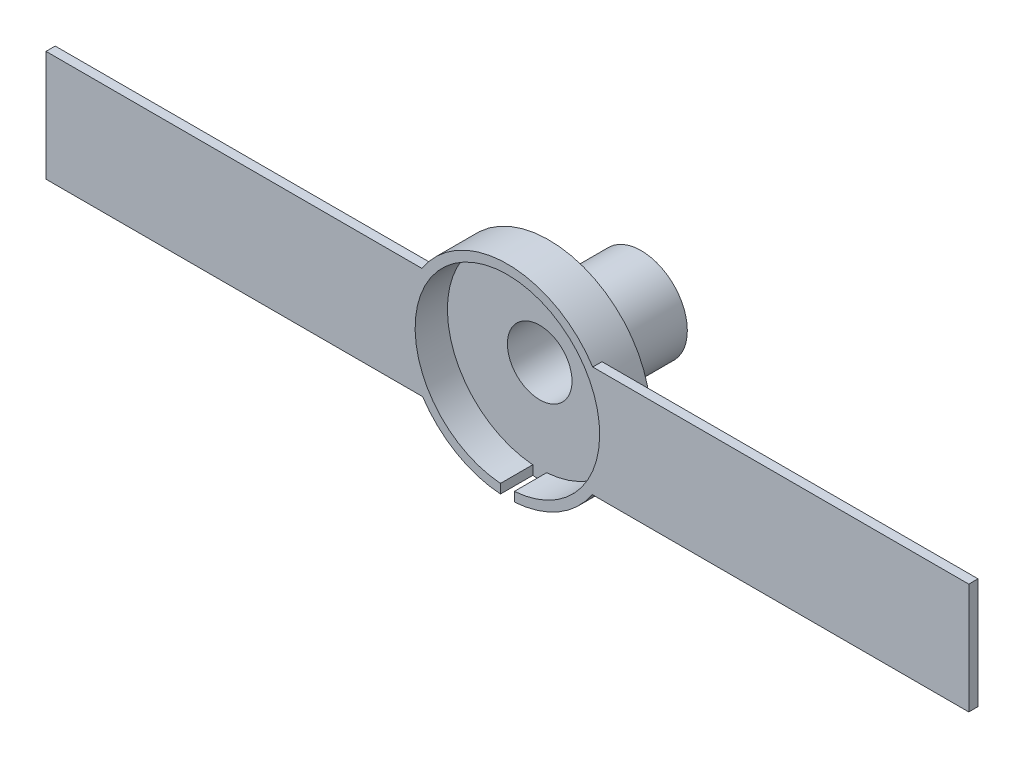
ISO-10303-21;
HEADER;
FILE_DESCRIPTION(('STEP AP214'),'2;1');
FILE_NAME('part.step','',(''),(''),'','','');
FILE_SCHEMA(('AUTOMOTIVE_DESIGN { 1 0 10303 214 1 1 1 1 }'));
ENDSEC;
DATA;
#1=APPLICATION_CONTEXT('core data for automotive mechanical design processes');
#2=APPLICATION_PROTOCOL_DEFINITION('international standard','automotive_design',2000,#1);
#3=PRODUCT_CONTEXT('',#1,'mechanical');
#4=PRODUCT('Part','Part','',(#3));
#5=PRODUCT_RELATED_PRODUCT_CATEGORY('part','',(#4));
#6=PRODUCT_DEFINITION_FORMATION('','',#4);
#7=PRODUCT_DEFINITION_CONTEXT('part definition',#1,'design');
#8=PRODUCT_DEFINITION('design','',#6,#7);
#9=PRODUCT_DEFINITION_SHAPE('','',#8);
#10=(LENGTH_UNIT() NAMED_UNIT(*) SI_UNIT(.MILLI.,.METRE.));
#11=(NAMED_UNIT(*) PLANE_ANGLE_UNIT() SI_UNIT($,.RADIAN.));
#12=(NAMED_UNIT(*) SI_UNIT($,.STERADIAN.) SOLID_ANGLE_UNIT());
#13=UNCERTAINTY_MEASURE_WITH_UNIT(LENGTH_MEASURE(1.E-05),#10,'distance_accuracy_value','');
#14=(GEOMETRIC_REPRESENTATION_CONTEXT(3) GLOBAL_UNCERTAINTY_ASSIGNED_CONTEXT((#13)) GLOBAL_UNIT_ASSIGNED_CONTEXT((#10,
#11,#12)) REPRESENTATION_CONTEXT('',''));
#15=CARTESIAN_POINT('',(0.,0.,0.));
#16=DIRECTION('',(0.,0.,1.));
#17=DIRECTION('',(1.,0.,0.));
#18=AXIS2_PLACEMENT_3D('',#15,#16,#17);
#19=CARTESIAN_POINT('',(0.,0.,11.));
#20=DIRECTION('',(0.,0.,-1.));
#21=DIRECTION('',(-1.,0.,0.));
#22=AXIS2_PLACEMENT_3D('',#19,#20,#21);
#23=CYLINDRICAL_SURFACE('',#22,11.);
#24=CARTESIAN_POINT('',(0.,0.,10.));
#25=DIRECTION('',(0.,0.,1.));
#26=DIRECTION('',(1.,0.,0.));
#27=AXIS2_PLACEMENT_3D('',#24,#25,#26);
#28=CIRCLE('',#27,11.);
#29=CARTESIAN_POINT('',(11.,0.,10.));
#30=VERTEX_POINT('',#29);
#31=EDGE_CURVE('E249',#30,#30,#28,.T.);
#32=ORIENTED_EDGE('',*,*,#31,.T.);
#33=EDGE_LOOP('',(#32));
#34=FACE_BOUND('',#33,.T.);
#35=DIRECTION('',(0.,0.,-1.));
#36=VECTOR('',#35,1.);
#37=CARTESIAN_POINT('',(-9.18653825051517,-6.05041444628561,11.));
#38=LINE('',#37,#36);
#39=CARTESIAN_POINT('',(-9.18653825051517,-6.05041444628561,14.5));
#40=VERTEX_POINT('',#39);
#41=CARTESIAN_POINT('',(-9.18653825051517,-6.05041444628561,13.5));
#42=VERTEX_POINT('',#41);
#43=EDGE_CURVE('E55',#40,#42,#38,.T.);
#44=ORIENTED_EDGE('',*,*,#43,.T.);
#45=CARTESIAN_POINT('',(0.,0.,13.5));
#46=DIRECTION('',(0.,0.,1.));
#47=DIRECTION('',(1.,0.,0.));
#48=AXIS2_PLACEMENT_3D('',#45,#46,#47);
#49=CIRCLE('',#48,11.);
#50=CARTESIAN_POINT('',(-9.25215822060091,5.94958555371439,13.5));
#51=VERTEX_POINT('',#50);
#52=EDGE_CURVE('E137',#42,#51,#49,.F.);
#53=ORIENTED_EDGE('',*,*,#52,.T.);
#54=DIRECTION('',(0.,0.,-1.));
#55=VECTOR('',#54,1.);
#56=CARTESIAN_POINT('',(-9.25215822060091,5.94958555371439,11.));
#57=LINE('',#56,#55);
#58=CARTESIAN_POINT('',(-9.25215822060091,5.94958555371439,14.5));
#59=VERTEX_POINT('',#58);
#60=EDGE_CURVE('E157',#51,#59,#57,.F.);
#61=ORIENTED_EDGE('',*,*,#60,.T.);
#62=CARTESIAN_POINT('',(0.,0.,14.5));
#63=DIRECTION('',(0.,0.,1.));
#64=DIRECTION('',(1.,0.,0.));
#65=AXIS2_PLACEMENT_3D('',#62,#63,#64);
#66=CIRCLE('',#65,11.);
#67=CARTESIAN_POINT('',(9.25215822060091,5.94958555371439,14.5));
#68=VERTEX_POINT('',#67);
#69=EDGE_CURVE('E245',#68,#59,#66,.T.);
#70=ORIENTED_EDGE('',*,*,#69,.F.);
#71=DIRECTION('',(0.,0.,-1.));
#72=VECTOR('',#71,1.);
#73=CARTESIAN_POINT('',(9.25215822060091,5.94958555371439,11.));
#74=LINE('',#73,#72);
#75=CARTESIAN_POINT('',(9.25215822060091,5.94958555371439,13.5));
#76=VERTEX_POINT('',#75);
#77=EDGE_CURVE('E63',#76,#68,#74,.F.);
#78=ORIENTED_EDGE('',*,*,#77,.F.);
#79=CARTESIAN_POINT('',(0.,0.,13.5));
#80=DIRECTION('',(0.,0.,-1.));
#81=DIRECTION('',(-1.,0.,0.));
#82=AXIS2_PLACEMENT_3D('',#79,#80,#81);
#83=CIRCLE('',#82,11.);
#84=CARTESIAN_POINT('',(9.18653825051517,-6.05041444628561,13.5));
#85=VERTEX_POINT('',#84);
#86=EDGE_CURVE('E174',#85,#76,#83,.F.);
#87=ORIENTED_EDGE('',*,*,#86,.F.);
#88=DIRECTION('',(0.,0.,-1.));
#89=VECTOR('',#88,1.);
#90=CARTESIAN_POINT('',(9.18653825051517,-6.05041444628561,11.));
#91=LINE('',#90,#89);
#92=CARTESIAN_POINT('',(9.18653825051517,-6.05041444628561,14.5));
#93=VERTEX_POINT('',#92);
#94=EDGE_CURVE('E199',#93,#85,#91,.T.);
#95=ORIENTED_EDGE('',*,*,#94,.F.);
#96=CARTESIAN_POINT('',(0.750000000000002,-10.974402033824,14.5));
#97=VERTEX_POINT('',#96);
#98=EDGE_CURVE('E240',#97,#93,#66,.T.);
#99=ORIENTED_EDGE('',*,*,#98,.F.);
#100=DIRECTION('',(0.,0.,-1.));
#101=VECTOR('',#100,1.);
#102=CARTESIAN_POINT('',(0.750000000000001,-10.974402033824,11.));
#103=LINE('',#102,#101);
#104=CARTESIAN_POINT('',(0.750000000000001,-10.974402033824,11.));
#105=VERTEX_POINT('',#104);
#106=EDGE_CURVE('E217',#105,#97,#103,.F.);
#107=ORIENTED_EDGE('',*,*,#106,.F.);
#108=CARTESIAN_POINT('',(0.,0.,11.));
#109=DIRECTION('',(0.,0.,-1.));
#110=DIRECTION('',(-1.,0.,0.));
#111=AXIS2_PLACEMENT_3D('',#108,#109,#110);
#112=CIRCLE('',#111,11.);
#113=CARTESIAN_POINT('',(-0.749999999999999,-10.974402033824,11.));
#114=VERTEX_POINT('',#113);
#115=EDGE_CURVE('E220',#114,#105,#112,.F.);
#116=ORIENTED_EDGE('',*,*,#115,.F.);
#117=DIRECTION('',(0.,0.,-1.));
#118=VECTOR('',#117,1.);
#119=CARTESIAN_POINT('',(-0.749999999999999,-10.974402033824,11.));
#120=LINE('',#119,#118);
#121=CARTESIAN_POINT('',(-0.749999999999999,-10.974402033824,14.5));
#122=VERTEX_POINT('',#121);
#123=EDGE_CURVE('E212',#122,#114,#120,.T.);
#124=ORIENTED_EDGE('',*,*,#123,.F.);
#125=EDGE_CURVE('E239',#40,#122,#66,.T.);
#126=ORIENTED_EDGE('',*,*,#125,.F.);
#127=EDGE_LOOP('',(#44,#53,#61,#70,#78,#87,#95,#99,#107,#116,#124,#126));
#128=FACE_BOUND('',#127,.T.);
#129=ADVANCED_FACE('F39',(#34,#128),#23,.T.);
#130=CARTESIAN_POINT('',(0.,0.,11.));
#131=DIRECTION('',(0.,0.,1.));
#132=DIRECTION('',(1.,0.,0.));
#133=AXIS2_PLACEMENT_3D('',#130,#131,#132);
#134=PLANE('',#133);
#135=CARTESIAN_POINT('',(0.,0.,11.));
#136=DIRECTION('',(0.,0.,1.));
#137=DIRECTION('',(1.,0.,0.));
#138=AXIS2_PLACEMENT_3D('',#135,#136,#137);
#139=CIRCLE('',#138,3.5);
#140=CARTESIAN_POINT('',(3.5,0.,11.));
#141=VERTEX_POINT('',#140);
#142=EDGE_CURVE('E244',#141,#141,#139,.T.);
#143=ORIENTED_EDGE('',*,*,#142,.F.);
#144=EDGE_LOOP('',(#143));
#145=FACE_BOUND('',#144,.T.);
#146=DIRECTION('',(0.,1.,0.));
#147=VECTOR('',#146,1.);
#148=CARTESIAN_POINT('',(0.750000000000001,-11.001,11.));
#149=LINE('',#148,#147);
#150=CARTESIAN_POINT('',(0.750000000000001,-9.97183533758957,11.));
#151=VERTEX_POINT('',#150);
#152=EDGE_CURVE('E183',#105,#151,#149,.T.);
#153=ORIENTED_EDGE('',*,*,#152,.T.);
#154=CARTESIAN_POINT('',(0.,0.,11.));
#155=DIRECTION('',(0.,0.,1.));
#156=DIRECTION('',(1.,0.,0.));
#157=AXIS2_PLACEMENT_3D('',#154,#155,#156);
#158=CIRCLE('',#157,10.);
#159=CARTESIAN_POINT('',(-0.749999999999999,-9.97183533758957,11.));
#160=VERTEX_POINT('',#159);
#161=EDGE_CURVE('E262',#160,#151,#158,.F.);
#162=ORIENTED_EDGE('',*,*,#161,.F.);
#163=DIRECTION('',(0.,1.,0.));
#164=VECTOR('',#163,1.);
#165=CARTESIAN_POINT('',(-0.749999999999999,-11.001,11.));
#166=LINE('',#165,#164);
#167=EDGE_CURVE('E224',#114,#160,#166,.T.);
#168=ORIENTED_EDGE('',*,*,#167,.F.);
#169=ORIENTED_EDGE('',*,*,#115,.T.);
#170=EDGE_LOOP('',(#153,#162,#168,#169));
#171=FACE_BOUND('',#170,.T.);
#172=ADVANCED_FACE('F308',(#145,#171),#134,.T.);
#173=CARTESIAN_POINT('',(0.,0.,0.));
#174=DIRECTION('',(0.,0.,1.));
#175=DIRECTION('',(1.,0.,0.));
#176=AXIS2_PLACEMENT_3D('',#173,#174,#175);
#177=PLANE('',#176);
#178=CARTESIAN_POINT('',(0.,0.,0.));
#179=DIRECTION('',(0.,0.,1.));
#180=DIRECTION('',(1.,0.,0.));
#181=AXIS2_PLACEMENT_3D('',#178,#179,#180);
#182=CIRCLE('',#181,5.);
#183=CARTESIAN_POINT('',(5.,0.,0.));
#184=VERTEX_POINT('',#183);
#185=EDGE_CURVE('E257',#184,#184,#182,.T.);
#186=ORIENTED_EDGE('',*,*,#185,.F.);
#187=EDGE_LOOP('',(#186));
#188=FACE_BOUND('',#187,.T.);
#189=CARTESIAN_POINT('',(0.,0.,0.));
#190=DIRECTION('',(0.,0.,1.));
#191=DIRECTION('',(1.,0.,0.));
#192=AXIS2_PLACEMENT_3D('',#189,#190,#191);
#193=CIRCLE('',#192,3.5);
#194=CARTESIAN_POINT('',(3.5,0.,0.));
#195=VERTEX_POINT('',#194);
#196=EDGE_CURVE('E253',#195,#195,#193,.T.);
#197=ORIENTED_EDGE('',*,*,#196,.T.);
#198=EDGE_LOOP('',(#197));
#199=FACE_BOUND('',#198,.T.);
#200=ADVANCED_FACE('F310',(#188,#199),#177,.F.);
#201=CARTESIAN_POINT('',(0.,0.,10.));
#202=DIRECTION('',(0.,0.,-1.));
#203=DIRECTION('',(-1.,0.,0.));
#204=AXIS2_PLACEMENT_3D('',#201,#202,#203);
#205=CYLINDRICAL_SURFACE('',#204,5.);
#206=CARTESIAN_POINT('',(0.,0.,10.));
#207=DIRECTION('',(0.,0.,1.));
#208=DIRECTION('',(1.,0.,0.));
#209=AXIS2_PLACEMENT_3D('',#206,#207,#208);
#210=CIRCLE('',#209,5.);
#211=CARTESIAN_POINT('',(5.,0.,10.));
#212=VERTEX_POINT('',#211);
#213=EDGE_CURVE('E258',#212,#212,#210,.T.);
#214=ORIENTED_EDGE('',*,*,#213,.F.);
#215=EDGE_LOOP('',(#214));
#216=FACE_BOUND('',#215,.T.);
#217=ORIENTED_EDGE('',*,*,#185,.T.);
#218=EDGE_LOOP('',(#217));
#219=FACE_BOUND('',#218,.T.);
#220=ADVANCED_FACE('F41',(#216,#219),#205,.T.);
#221=CARTESIAN_POINT('',(0.,0.,10.));
#222=DIRECTION('',(0.,0.,-1.));
#223=DIRECTION('',(-1.,0.,0.));
#224=AXIS2_PLACEMENT_3D('',#221,#222,#223);
#225=CYLINDRICAL_SURFACE('',#224,3.5);
#226=ORIENTED_EDGE('',*,*,#196,.F.);
#227=EDGE_LOOP('',(#226));
#228=FACE_BOUND('',#227,.T.);
#229=ORIENTED_EDGE('',*,*,#142,.T.);
#230=EDGE_LOOP('',(#229));
#231=FACE_BOUND('',#230,.T.);
#232=ADVANCED_FACE('F326',(#228,#231),#225,.F.);
#233=CARTESIAN_POINT('',(0.,0.,10.));
#234=DIRECTION('',(0.,0.,1.));
#235=DIRECTION('',(1.,0.,0.));
#236=AXIS2_PLACEMENT_3D('',#233,#234,#235);
#237=PLANE('',#236);
#238=ORIENTED_EDGE('',*,*,#213,.T.);
#239=EDGE_LOOP('',(#238));
#240=FACE_BOUND('',#239,.T.);
#241=ORIENTED_EDGE('',*,*,#31,.F.);
#242=EDGE_LOOP('',(#241));
#243=FACE_BOUND('',#242,.T.);
#244=ADVANCED_FACE('F324',(#240,#243),#237,.F.);
#245=CARTESIAN_POINT('',(0.,0.,14.5));
#246=DIRECTION('',(0.,0.,1.));
#247=DIRECTION('',(1.,0.,0.));
#248=AXIS2_PLACEMENT_3D('',#245,#246,#247);
#249=PLANE('',#248);
#250=DIRECTION('',(0.,1.,0.));
#251=VECTOR('',#250,1.);
#252=CARTESIAN_POINT('',(0.750000000000002,-11.001,14.5));
#253=LINE('',#252,#251);
#254=CARTESIAN_POINT('',(0.750000000000002,-9.97183533758957,14.5));
#255=VERTEX_POINT('',#254);
#256=EDGE_CURVE('E225',#97,#255,#253,.T.);
#257=ORIENTED_EDGE('',*,*,#256,.F.);
#258=ORIENTED_EDGE('',*,*,#98,.T.);
#259=DIRECTION('',(1.,0.,0.));
#260=VECTOR('',#259,1.);
#261=CARTESIAN_POINT('',(-11.001,-6.05041444628561,14.5));
#262=LINE('',#261,#260);
#263=CARTESIAN_POINT('',(50.,-6.05041444628561,14.5));
#264=VERTEX_POINT('',#263);
#265=EDGE_CURVE('E178',#93,#264,#262,.T.);
#266=ORIENTED_EDGE('',*,*,#265,.T.);
#267=DIRECTION('',(0.,-1.,0.));
#268=VECTOR('',#267,1.);
#269=CARTESIAN_POINT('',(50.,-6.05041444628561,14.5));
#270=LINE('',#269,#268);
#271=CARTESIAN_POINT('',(50.,5.94958555371439,14.5));
#272=VERTEX_POINT('',#271);
#273=EDGE_CURVE('E184',#272,#264,#270,.T.);
#274=ORIENTED_EDGE('',*,*,#273,.F.);
#275=DIRECTION('',(1.,0.,0.));
#276=VECTOR('',#275,1.);
#277=CARTESIAN_POINT('',(-11.001,5.94958555371439,14.5));
#278=LINE('',#277,#276);
#279=EDGE_CURVE('E177',#68,#272,#278,.T.);
#280=ORIENTED_EDGE('',*,*,#279,.F.);
#281=ORIENTED_EDGE('',*,*,#69,.T.);
#282=DIRECTION('',(-1.,0.,0.));
#283=VECTOR('',#282,1.);
#284=CARTESIAN_POINT('',(50.001,5.94958555371439,14.5));
#285=LINE('',#284,#283);
#286=CARTESIAN_POINT('',(-50.,5.94958555371439,14.5));
#287=VERTEX_POINT('',#286);
#288=EDGE_CURVE('E167',#59,#287,#285,.T.);
#289=ORIENTED_EDGE('',*,*,#288,.T.);
#290=DIRECTION('',(0.,-1.,0.));
#291=VECTOR('',#290,1.);
#292=CARTESIAN_POINT('',(-50.,-6.05041444628561,14.5));
#293=LINE('',#292,#291);
#294=CARTESIAN_POINT('',(-50.,-6.05041444628561,14.5));
#295=VERTEX_POINT('',#294);
#296=EDGE_CURVE('E149',#287,#295,#293,.T.);
#297=ORIENTED_EDGE('',*,*,#296,.T.);
#298=DIRECTION('',(-1.,0.,0.));
#299=VECTOR('',#298,1.);
#300=CARTESIAN_POINT('',(50.001,-6.05041444628561,14.5));
#301=LINE('',#300,#299);
#302=EDGE_CURVE('E139',#40,#295,#301,.T.);
#303=ORIENTED_EDGE('',*,*,#302,.F.);
#304=ORIENTED_EDGE('',*,*,#125,.T.);
#305=DIRECTION('',(0.,1.,0.));
#306=VECTOR('',#305,1.);
#307=CARTESIAN_POINT('',(-0.749999999999999,-11.001,14.5));
#308=LINE('',#307,#306);
#309=CARTESIAN_POINT('',(-0.749999999999999,-9.97183533758957,14.5));
#310=VERTEX_POINT('',#309);
#311=EDGE_CURVE('E228',#122,#310,#308,.T.);
#312=ORIENTED_EDGE('',*,*,#311,.T.);
#313=CARTESIAN_POINT('',(0.,0.,14.5));
#314=DIRECTION('',(0.,0.,1.));
#315=DIRECTION('',(1.,0.,0.));
#316=AXIS2_PLACEMENT_3D('',#313,#314,#315);
#317=CIRCLE('',#316,10.);
#318=EDGE_CURVE('E216',#255,#310,#317,.T.);
#319=ORIENTED_EDGE('',*,*,#318,.F.);
#320=EDGE_LOOP('',(#257,#258,#266,#274,#280,#281,#289,#297,#303,#304,#312,#319));
#321=FACE_BOUND('',#320,.T.);
#322=ADVANCED_FACE('F279',(#321),#249,.T.);
#323=CARTESIAN_POINT('',(0.,0.,14.5));
#324=DIRECTION('',(0.,0.,-1.));
#325=DIRECTION('',(-1.,0.,0.));
#326=AXIS2_PLACEMENT_3D('',#323,#324,#325);
#327=CYLINDRICAL_SURFACE('',#326,10.);
#328=DIRECTION('',(0.,0.,-1.));
#329=VECTOR('',#328,1.);
#330=CARTESIAN_POINT('',(0.750000000000002,-9.97183533758957,14.5));
#331=LINE('',#330,#329);
#332=EDGE_CURVE('E11',#255,#151,#331,.T.);
#333=ORIENTED_EDGE('',*,*,#332,.F.);
#334=ORIENTED_EDGE('',*,*,#318,.T.);
#335=DIRECTION('',(0.,0.,-1.));
#336=VECTOR('',#335,1.);
#337=CARTESIAN_POINT('',(-0.749999999999999,-9.97183533758957,14.5));
#338=LINE('',#337,#336);
#339=EDGE_CURVE('E48',#160,#310,#338,.F.);
#340=ORIENTED_EDGE('',*,*,#339,.F.);
#341=ORIENTED_EDGE('',*,*,#161,.T.);
#342=EDGE_LOOP('',(#333,#334,#340,#341));
#343=FACE_BOUND('',#342,.T.);
#344=ADVANCED_FACE('F282',(#343),#327,.F.);
#345=CARTESIAN_POINT('',(0.750000000000001,-11.001,11.));
#346=DIRECTION('',(1.,0.,0.));
#347=DIRECTION('',(0.,0.,-1.));
#348=AXIS2_PLACEMENT_3D('',#345,#346,#347);
#349=PLANE('',#348);
#350=ORIENTED_EDGE('',*,*,#332,.T.);
#351=ORIENTED_EDGE('',*,*,#152,.F.);
#352=ORIENTED_EDGE('',*,*,#106,.T.);
#353=ORIENTED_EDGE('',*,*,#256,.T.);
#354=EDGE_LOOP('',(#350,#351,#352,#353));
#355=FACE_BOUND('',#354,.T.);
#356=ADVANCED_FACE('F284',(#355),#349,.F.);
#357=CARTESIAN_POINT('',(-0.749999999999999,-11.001,11.));
#358=DIRECTION('',(-1.,0.,0.));
#359=DIRECTION('',(0.,0.,1.));
#360=AXIS2_PLACEMENT_3D('',#357,#358,#359);
#361=PLANE('',#360);
#362=ORIENTED_EDGE('',*,*,#339,.T.);
#363=ORIENTED_EDGE('',*,*,#311,.F.);
#364=ORIENTED_EDGE('',*,*,#123,.T.);
#365=ORIENTED_EDGE('',*,*,#167,.T.);
#366=EDGE_LOOP('',(#362,#363,#364,#365));
#367=FACE_BOUND('',#366,.T.);
#368=ADVANCED_FACE('F272',(#367),#361,.F.);
#369=CARTESIAN_POINT('',(-11.001,-6.05041444628561,13.5));
#370=DIRECTION('',(0.,0.,-1.));
#371=DIRECTION('',(-1.,0.,0.));
#372=AXIS2_PLACEMENT_3D('',#369,#370,#371);
#373=PLANE('',#372);
#374=DIRECTION('',(1.,0.,0.));
#375=VECTOR('',#374,1.);
#376=CARTESIAN_POINT('',(-11.001,-6.05041444628561,13.5));
#377=LINE('',#376,#375);
#378=CARTESIAN_POINT('',(50.,-6.05041444628561,13.5));
#379=VERTEX_POINT('',#378);
#380=EDGE_CURVE('E196',#85,#379,#377,.T.);
#381=ORIENTED_EDGE('',*,*,#380,.F.);
#382=ORIENTED_EDGE('',*,*,#86,.T.);
#383=DIRECTION('',(1.,0.,0.));
#384=VECTOR('',#383,1.);
#385=CARTESIAN_POINT('',(-11.001,5.94958555371439,13.5));
#386=LINE('',#385,#384);
#387=CARTESIAN_POINT('',(50.,5.94958555371439,13.5));
#388=VERTEX_POINT('',#387);
#389=EDGE_CURVE('E204',#76,#388,#386,.T.);
#390=ORIENTED_EDGE('',*,*,#389,.T.);
#391=DIRECTION('',(0.,1.,0.));
#392=VECTOR('',#391,1.);
#393=CARTESIAN_POINT('',(50.,-6.05041444628561,13.5));
#394=LINE('',#393,#392);
#395=EDGE_CURVE('E192',#379,#388,#394,.T.);
#396=ORIENTED_EDGE('',*,*,#395,.F.);
#397=EDGE_LOOP('',(#381,#382,#390,#396));
#398=FACE_BOUND('',#397,.T.);
#399=ADVANCED_FACE('F402',(#398),#373,.T.);
#400=CARTESIAN_POINT('',(-11.001,-6.05041444628561,14.5));
#401=DIRECTION('',(0.,-1.,0.));
#402=DIRECTION('',(0.,0.,-1.));
#403=AXIS2_PLACEMENT_3D('',#400,#401,#402);
#404=PLANE('',#403);
#405=ORIENTED_EDGE('',*,*,#265,.F.);
#406=ORIENTED_EDGE('',*,*,#94,.T.);
#407=ORIENTED_EDGE('',*,*,#380,.T.);
#408=DIRECTION('',(0.,0.,-1.));
#409=VECTOR('',#408,1.);
#410=CARTESIAN_POINT('',(50.,-6.05041444628561,14.5));
#411=LINE('',#410,#409);
#412=EDGE_CURVE('E179',#264,#379,#411,.T.);
#413=ORIENTED_EDGE('',*,*,#412,.F.);
#414=EDGE_LOOP('',(#405,#406,#407,#413));
#415=FACE_BOUND('',#414,.T.);
#416=ADVANCED_FACE('F292',(#415),#404,.T.);
#417=CARTESIAN_POINT('',(-11.001,5.94958555371439,14.5));
#418=DIRECTION('',(0.,1.,0.));
#419=DIRECTION('',(0.,0.,1.));
#420=AXIS2_PLACEMENT_3D('',#417,#418,#419);
#421=PLANE('',#420);
#422=ORIENTED_EDGE('',*,*,#389,.F.);
#423=ORIENTED_EDGE('',*,*,#77,.T.);
#424=ORIENTED_EDGE('',*,*,#279,.T.);
#425=DIRECTION('',(0.,0.,1.));
#426=VECTOR('',#425,1.);
#427=CARTESIAN_POINT('',(50.,5.94958555371439,14.5));
#428=LINE('',#427,#426);
#429=EDGE_CURVE('E188',#388,#272,#428,.T.);
#430=ORIENTED_EDGE('',*,*,#429,.F.);
#431=EDGE_LOOP('',(#422,#423,#424,#430));
#432=FACE_BOUND('',#431,.T.);
#433=ADVANCED_FACE('F299',(#432),#421,.T.);
#434=CARTESIAN_POINT('',(50.,0.,0.));
#435=DIRECTION('',(-1.,0.,0.));
#436=DIRECTION('',(0.,0.,1.));
#437=AXIS2_PLACEMENT_3D('',#434,#435,#436);
#438=PLANE('',#437);
#439=ORIENTED_EDGE('',*,*,#395,.T.);
#440=ORIENTED_EDGE('',*,*,#429,.T.);
#441=ORIENTED_EDGE('',*,*,#273,.T.);
#442=ORIENTED_EDGE('',*,*,#412,.T.);
#443=EDGE_LOOP('',(#439,#440,#441,#442));
#444=FACE_BOUND('',#443,.T.);
#445=ADVANCED_FACE('F297',(#444),#438,.F.);
#446=CARTESIAN_POINT('',(-50.,0.,0.));
#447=DIRECTION('',(1.,0.,0.));
#448=DIRECTION('',(0.,0.,1.));
#449=AXIS2_PLACEMENT_3D('',#446,#447,#448);
#450=PLANE('',#449);
#451=DIRECTION('',(0.,1.,0.));
#452=VECTOR('',#451,1.);
#453=CARTESIAN_POINT('',(-50.,-6.05041444628561,13.5));
#454=LINE('',#453,#452);
#455=CARTESIAN_POINT('',(-50.,-6.05041444628561,13.5));
#456=VERTEX_POINT('',#455);
#457=CARTESIAN_POINT('',(-50.,5.94958555371439,13.5));
#458=VERTEX_POINT('',#457);
#459=EDGE_CURVE('E135',#456,#458,#454,.T.);
#460=ORIENTED_EDGE('',*,*,#459,.F.);
#461=DIRECTION('',(0.,0.,-1.));
#462=VECTOR('',#461,1.);
#463=CARTESIAN_POINT('',(-50.,-6.05041444628561,14.5));
#464=LINE('',#463,#462);
#465=EDGE_CURVE('E143',#295,#456,#464,.T.);
#466=ORIENTED_EDGE('',*,*,#465,.F.);
#467=ORIENTED_EDGE('',*,*,#296,.F.);
#468=DIRECTION('',(0.,0.,1.));
#469=VECTOR('',#468,1.);
#470=CARTESIAN_POINT('',(-50.,5.94958555371439,14.5));
#471=LINE('',#470,#469);
#472=EDGE_CURVE('E140',#458,#287,#471,.T.);
#473=ORIENTED_EDGE('',*,*,#472,.F.);
#474=EDGE_LOOP('',(#460,#466,#467,#473));
#475=FACE_BOUND('',#474,.T.);
#476=ADVANCED_FACE('F152',(#475),#450,.F.);
#477=CARTESIAN_POINT('',(50.001,-6.05041444628561,14.5));
#478=DIRECTION('',(0.,1.,0.));
#479=DIRECTION('',(0.,0.,1.));
#480=AXIS2_PLACEMENT_3D('',#477,#478,#479);
#481=PLANE('',#480);
#482=ORIENTED_EDGE('',*,*,#43,.F.);
#483=ORIENTED_EDGE('',*,*,#302,.T.);
#484=ORIENTED_EDGE('',*,*,#465,.T.);
#485=DIRECTION('',(-1.,0.,0.));
#486=VECTOR('',#485,1.);
#487=CARTESIAN_POINT('',(50.001,-6.05041444628561,13.5));
#488=LINE('',#487,#486);
#489=EDGE_CURVE('E130',#42,#456,#488,.T.);
#490=ORIENTED_EDGE('',*,*,#489,.F.);
#491=EDGE_LOOP('',(#482,#483,#484,#490));
#492=FACE_BOUND('',#491,.T.);
#493=ADVANCED_FACE('F144',(#492),#481,.F.);
#494=CARTESIAN_POINT('',(50.001,5.94958555371439,14.5));
#495=DIRECTION('',(0.,-1.,0.));
#496=DIRECTION('',(0.,0.,-1.));
#497=AXIS2_PLACEMENT_3D('',#494,#495,#496);
#498=PLANE('',#497);
#499=ORIENTED_EDGE('',*,*,#60,.F.);
#500=DIRECTION('',(-1.,0.,0.));
#501=VECTOR('',#500,1.);
#502=CARTESIAN_POINT('',(50.001,5.94958555371439,13.5));
#503=LINE('',#502,#501);
#504=EDGE_CURVE('E164',#51,#458,#503,.T.);
#505=ORIENTED_EDGE('',*,*,#504,.T.);
#506=ORIENTED_EDGE('',*,*,#472,.T.);
#507=ORIENTED_EDGE('',*,*,#288,.F.);
#508=EDGE_LOOP('',(#499,#505,#506,#507));
#509=FACE_BOUND('',#508,.T.);
#510=ADVANCED_FACE('F462',(#509),#498,.F.);
#511=CARTESIAN_POINT('',(50.001,-6.05041444628561,13.5));
#512=DIRECTION('',(0.,0.,1.));
#513=DIRECTION('',(1.,0.,0.));
#514=AXIS2_PLACEMENT_3D('',#511,#512,#513);
#515=PLANE('',#514);
#516=ORIENTED_EDGE('',*,*,#52,.F.);
#517=ORIENTED_EDGE('',*,*,#489,.T.);
#518=ORIENTED_EDGE('',*,*,#459,.T.);
#519=ORIENTED_EDGE('',*,*,#504,.F.);
#520=EDGE_LOOP('',(#516,#517,#518,#519));
#521=FACE_BOUND('',#520,.T.);
#522=ADVANCED_FACE('F132',(#521),#515,.F.);
#523=CLOSED_SHELL('',(#129,#172,#200,#220,#232,#244,#322,#344,#356,#368,#399,#416,#433,#445,
#476,#493,#510,#522));
#524=MANIFOLD_SOLID_BREP('B2',#523);
#525=ADVANCED_BREP_SHAPE_REPRESENTATION('',(#18,#524),#14);
#526=SHAPE_DEFINITION_REPRESENTATION(#9,#525);
ENDSEC;
END-ISO-10303-21;
